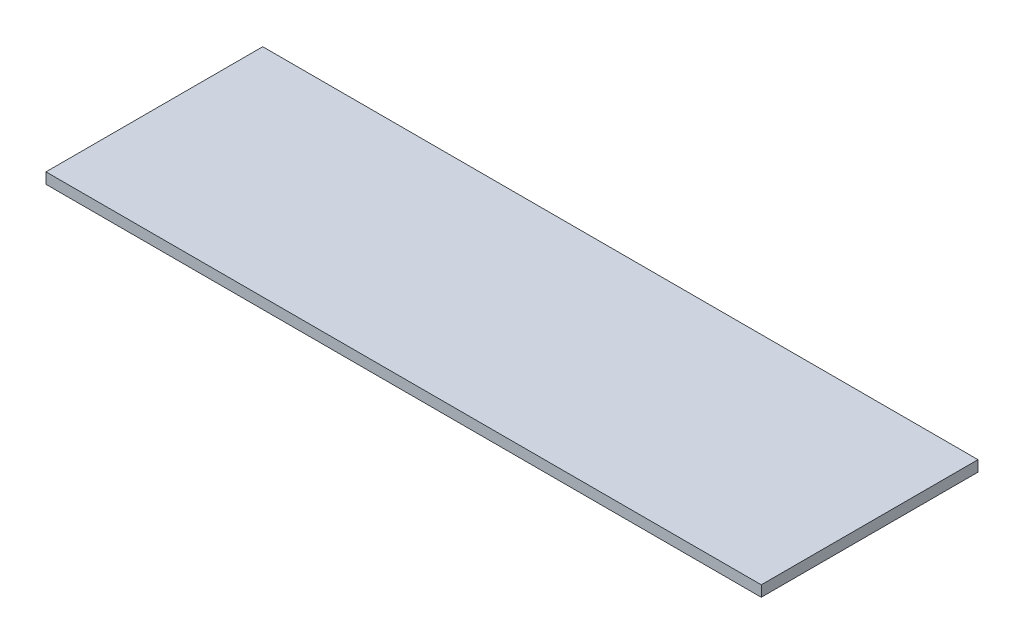
ISO-10303-21;
HEADER;
FILE_DESCRIPTION(('STEP AP214'),'2;1');
FILE_NAME('part.step','',(''),(''),'','','');
FILE_SCHEMA(('AUTOMOTIVE_DESIGN { 1 0 10303 214 1 1 1 1 }'));
ENDSEC;
DATA;
#1=APPLICATION_CONTEXT('core data for automotive mechanical design processes');
#2=APPLICATION_PROTOCOL_DEFINITION('international standard','automotive_design',2000,#1);
#3=PRODUCT_CONTEXT('',#1,'mechanical');
#4=PRODUCT('Part','Part','',(#3));
#5=PRODUCT_RELATED_PRODUCT_CATEGORY('part','',(#4));
#6=PRODUCT_DEFINITION_FORMATION('','',#4);
#7=PRODUCT_DEFINITION_CONTEXT('part definition',#1,'design');
#8=PRODUCT_DEFINITION('design','',#6,#7);
#9=PRODUCT_DEFINITION_SHAPE('','',#8);
#10=(LENGTH_UNIT() NAMED_UNIT(*) SI_UNIT(.MILLI.,.METRE.));
#11=(NAMED_UNIT(*) PLANE_ANGLE_UNIT() SI_UNIT($,.RADIAN.));
#12=(NAMED_UNIT(*) SI_UNIT($,.STERADIAN.) SOLID_ANGLE_UNIT());
#13=UNCERTAINTY_MEASURE_WITH_UNIT(LENGTH_MEASURE(1.E-05),#10,'distance_accuracy_value','');
#14=(GEOMETRIC_REPRESENTATION_CONTEXT(3) GLOBAL_UNCERTAINTY_ASSIGNED_CONTEXT((#13)) GLOBAL_UNIT_ASSIGNED_CONTEXT((#10,
#11,#12)) REPRESENTATION_CONTEXT('',''));
#15=CARTESIAN_POINT('',(0.,0.,0.));
#16=DIRECTION('',(0.,0.,1.));
#17=DIRECTION('',(1.,0.,0.));
#18=AXIS2_PLACEMENT_3D('',#15,#16,#17);
#19=CARTESIAN_POINT('',(594.,18.,-180.));
#20=DIRECTION('',(-1.,0.,0.));
#21=DIRECTION('',(0.,0.,1.));
#22=AXIS2_PLACEMENT_3D('',#19,#20,#21);
#23=PLANE('',#22);
#24=DIRECTION('',(0.,0.,-1.));
#25=VECTOR('',#24,1.);
#26=CARTESIAN_POINT('',(594.,0.,-180.));
#27=LINE('',#26,#25);
#28=CARTESIAN_POINT('',(594.,0.,180.));
#29=VERTEX_POINT('',#28);
#30=CARTESIAN_POINT('',(594.,0.,-180.));
#31=VERTEX_POINT('',#30);
#32=EDGE_CURVE('E100',#29,#31,#27,.T.);
#33=ORIENTED_EDGE('',*,*,#32,.T.);
#34=DIRECTION('',(0.,-1.,0.));
#35=VECTOR('',#34,1.);
#36=CARTESIAN_POINT('',(594.,18.,-180.));
#37=LINE('',#36,#35);
#38=CARTESIAN_POINT('',(594.,18.,-180.));
#39=VERTEX_POINT('',#38);
#40=EDGE_CURVE('E11',#39,#31,#37,.T.);
#41=ORIENTED_EDGE('',*,*,#40,.F.);
#42=DIRECTION('',(0.,0.,-1.));
#43=VECTOR('',#42,1.);
#44=CARTESIAN_POINT('',(594.,18.,-180.));
#45=LINE('',#44,#43);
#46=CARTESIAN_POINT('',(594.,18.,180.));
#47=VERTEX_POINT('',#46);
#48=EDGE_CURVE('E88',#47,#39,#45,.T.);
#49=ORIENTED_EDGE('',*,*,#48,.F.);
#50=DIRECTION('',(0.,-1.,0.));
#51=VECTOR('',#50,1.);
#52=CARTESIAN_POINT('',(594.,18.,180.));
#53=LINE('',#52,#51);
#54=EDGE_CURVE('E96',#47,#29,#53,.T.);
#55=ORIENTED_EDGE('',*,*,#54,.T.);
#56=EDGE_LOOP('',(#33,#41,#49,#55));
#57=FACE_BOUND('',#56,.T.);
#58=ADVANCED_FACE('F37',(#57),#23,.F.);
#59=CARTESIAN_POINT('',(-594.,18.,-180.));
#60=DIRECTION('',(0.,0.,1.));
#61=DIRECTION('',(1.,0.,0.));
#62=AXIS2_PLACEMENT_3D('',#59,#60,#61);
#63=PLANE('',#62);
#64=DIRECTION('',(-1.,0.,0.));
#65=VECTOR('',#64,1.);
#66=CARTESIAN_POINT('',(-594.,0.,-180.));
#67=LINE('',#66,#65);
#68=CARTESIAN_POINT('',(-594.,0.,-180.));
#69=VERTEX_POINT('',#68);
#70=EDGE_CURVE('E92',#31,#69,#67,.T.);
#71=ORIENTED_EDGE('',*,*,#70,.T.);
#72=DIRECTION('',(0.,-1.,0.));
#73=VECTOR('',#72,1.);
#74=CARTESIAN_POINT('',(-594.,18.,-180.));
#75=LINE('',#74,#73);
#76=CARTESIAN_POINT('',(-594.,18.,-180.));
#77=VERTEX_POINT('',#76);
#78=EDGE_CURVE('E45',#77,#69,#75,.T.);
#79=ORIENTED_EDGE('',*,*,#78,.F.);
#80=DIRECTION('',(-1.,0.,0.));
#81=VECTOR('',#80,1.);
#82=CARTESIAN_POINT('',(-594.,18.,-180.));
#83=LINE('',#82,#81);
#84=EDGE_CURVE('E83',#39,#77,#83,.T.);
#85=ORIENTED_EDGE('',*,*,#84,.F.);
#86=ORIENTED_EDGE('',*,*,#40,.T.);
#87=EDGE_LOOP('',(#71,#79,#85,#86));
#88=FACE_BOUND('',#87,.T.);
#89=ADVANCED_FACE('F91',(#88),#63,.F.);
#90=CARTESIAN_POINT('',(-594.,18.,-180.));
#91=DIRECTION('',(1.,0.,0.));
#92=DIRECTION('',(0.,0.,-1.));
#93=AXIS2_PLACEMENT_3D('',#90,#91,#92);
#94=PLANE('',#93);
#95=DIRECTION('',(0.,0.,1.));
#96=VECTOR('',#95,1.);
#97=CARTESIAN_POINT('',(-594.,0.,-180.));
#98=LINE('',#97,#96);
#99=CARTESIAN_POINT('',(-594.,0.,180.));
#100=VERTEX_POINT('',#99);
#101=EDGE_CURVE('E70',#69,#100,#98,.T.);
#102=ORIENTED_EDGE('',*,*,#101,.T.);
#103=DIRECTION('',(0.,-1.,0.));
#104=VECTOR('',#103,1.);
#105=CARTESIAN_POINT('',(-594.,18.,180.));
#106=LINE('',#105,#104);
#107=CARTESIAN_POINT('',(-594.,18.,180.));
#108=VERTEX_POINT('',#107);
#109=EDGE_CURVE('E93',#108,#100,#106,.T.);
#110=ORIENTED_EDGE('',*,*,#109,.F.);
#111=DIRECTION('',(0.,0.,1.));
#112=VECTOR('',#111,1.);
#113=CARTESIAN_POINT('',(-594.,18.,-180.));
#114=LINE('',#113,#112);
#115=EDGE_CURVE('E86',#77,#108,#114,.T.);
#116=ORIENTED_EDGE('',*,*,#115,.F.);
#117=ORIENTED_EDGE('',*,*,#78,.T.);
#118=EDGE_LOOP('',(#102,#110,#116,#117));
#119=FACE_BOUND('',#118,.T.);
#120=ADVANCED_FACE('F94',(#119),#94,.F.);
#121=CARTESIAN_POINT('',(-594.,18.,180.));
#122=DIRECTION('',(0.,0.,-1.));
#123=DIRECTION('',(-1.,0.,0.));
#124=AXIS2_PLACEMENT_3D('',#121,#122,#123);
#125=PLANE('',#124);
#126=DIRECTION('',(1.,0.,0.));
#127=VECTOR('',#126,1.);
#128=CARTESIAN_POINT('',(-594.,0.,180.));
#129=LINE('',#128,#127);
#130=EDGE_CURVE('E76',#100,#29,#129,.T.);
#131=ORIENTED_EDGE('',*,*,#130,.T.);
#132=ORIENTED_EDGE('',*,*,#54,.F.);
#133=DIRECTION('',(1.,0.,0.));
#134=VECTOR('',#133,1.);
#135=CARTESIAN_POINT('',(-594.,18.,180.));
#136=LINE('',#135,#134);
#137=EDGE_CURVE('E53',#108,#47,#136,.T.);
#138=ORIENTED_EDGE('',*,*,#137,.F.);
#139=ORIENTED_EDGE('',*,*,#109,.T.);
#140=EDGE_LOOP('',(#131,#132,#138,#139));
#141=FACE_BOUND('',#140,.T.);
#142=ADVANCED_FACE('F107',(#141),#125,.F.);
#143=CARTESIAN_POINT('',(0.,18.,0.));
#144=DIRECTION('',(0.,1.,0.));
#145=DIRECTION('',(0.,0.,1.));
#146=AXIS2_PLACEMENT_3D('',#143,#144,#145);
#147=PLANE('',#146);
#148=ORIENTED_EDGE('',*,*,#48,.T.);
#149=ORIENTED_EDGE('',*,*,#84,.T.);
#150=ORIENTED_EDGE('',*,*,#115,.T.);
#151=ORIENTED_EDGE('',*,*,#137,.T.);
#152=EDGE_LOOP('',(#148,#149,#150,#151));
#153=FACE_BOUND('',#152,.T.);
#154=ADVANCED_FACE('F84',(#153),#147,.T.);
#155=CARTESIAN_POINT('',(0.,0.,0.));
#156=DIRECTION('',(0.,1.,0.));
#157=DIRECTION('',(0.,0.,1.));
#158=AXIS2_PLACEMENT_3D('',#155,#156,#157);
#159=PLANE('',#158);
#160=ORIENTED_EDGE('',*,*,#32,.F.);
#161=ORIENTED_EDGE('',*,*,#130,.F.);
#162=ORIENTED_EDGE('',*,*,#101,.F.);
#163=ORIENTED_EDGE('',*,*,#70,.F.);
#164=EDGE_LOOP('',(#160,#161,#162,#163));
#165=FACE_BOUND('',#164,.T.);
#166=ADVANCED_FACE('F110',(#165),#159,.F.);
#167=CLOSED_SHELL('',(#58,#89,#120,#142,#154,#166));
#168=MANIFOLD_SOLID_BREP('B2',#167);
#169=ADVANCED_BREP_SHAPE_REPRESENTATION('',(#18,#168),#14);
#170=SHAPE_DEFINITION_REPRESENTATION(#9,#169);
ENDSEC;
END-ISO-10303-21;
